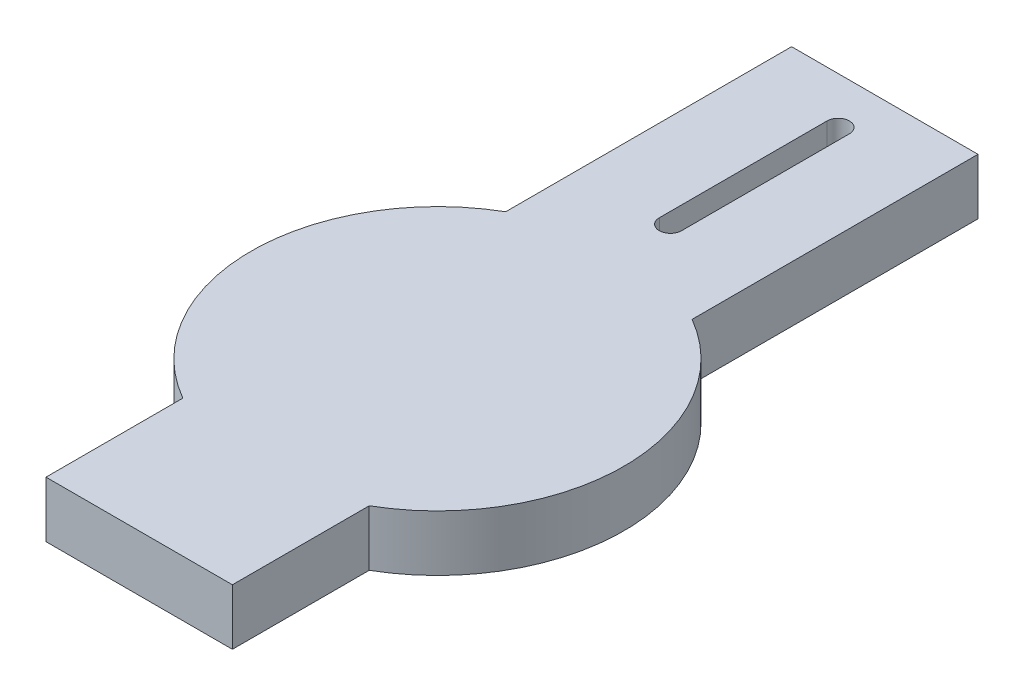
ISO-10303-21;
HEADER;
FILE_DESCRIPTION(('STEP AP214'),'2;1');
FILE_NAME('part.step','',(''),(''),'','','');
FILE_SCHEMA(('AUTOMOTIVE_DESIGN { 1 0 10303 214 1 1 1 1 }'));
ENDSEC;
DATA;
#1=APPLICATION_CONTEXT('core data for automotive mechanical design processes');
#2=APPLICATION_PROTOCOL_DEFINITION('international standard','automotive_design',2000,#1);
#3=PRODUCT_CONTEXT('',#1,'mechanical');
#4=PRODUCT('Part','Part','',(#3));
#5=PRODUCT_RELATED_PRODUCT_CATEGORY('part','',(#4));
#6=PRODUCT_DEFINITION_FORMATION('','',#4);
#7=PRODUCT_DEFINITION_CONTEXT('part definition',#1,'design');
#8=PRODUCT_DEFINITION('design','',#6,#7);
#9=PRODUCT_DEFINITION_SHAPE('','',#8);
#10=(LENGTH_UNIT() NAMED_UNIT(*) SI_UNIT(.MILLI.,.METRE.));
#11=(NAMED_UNIT(*) PLANE_ANGLE_UNIT() SI_UNIT($,.RADIAN.));
#12=(NAMED_UNIT(*) SI_UNIT($,.STERADIAN.) SOLID_ANGLE_UNIT());
#13=UNCERTAINTY_MEASURE_WITH_UNIT(LENGTH_MEASURE(1.E-05),#10,'distance_accuracy_value','');
#14=(GEOMETRIC_REPRESENTATION_CONTEXT(3) GLOBAL_UNCERTAINTY_ASSIGNED_CONTEXT((#13)) GLOBAL_UNIT_ASSIGNED_CONTEXT((#10,
#11,#12)) REPRESENTATION_CONTEXT('',''));
#15=CARTESIAN_POINT('',(0.,0.,0.));
#16=DIRECTION('',(0.,0.,1.));
#17=DIRECTION('',(1.,0.,0.));
#18=AXIS2_PLACEMENT_3D('',#15,#16,#17);
#19=CARTESIAN_POINT('',(0.,3.81,0.));
#20=DIRECTION('',(0.,1.,0.));
#21=DIRECTION('',(0.,0.,1.));
#22=AXIS2_PLACEMENT_3D('',#19,#20,#21);
#23=PLANE('',#22);
#24=DIRECTION('',(-1.,0.,0.));
#25=VECTOR('',#24,1.);
#26=CARTESIAN_POINT('',(-6.35,3.81,-30.48));
#27=LINE('',#26,#25);
#28=CARTESIAN_POINT('',(6.35,3.81,-30.48));
#29=VERTEX_POINT('',#28);
#30=CARTESIAN_POINT('',(-6.35,3.81,-30.48));
#31=VERTEX_POINT('',#30);
#32=EDGE_CURVE('E162',#29,#31,#27,.T.);
#33=ORIENTED_EDGE('',*,*,#32,.T.);
#34=DIRECTION('',(0.,0.,1.));
#35=VECTOR('',#34,1.);
#36=CARTESIAN_POINT('',(-6.35,3.81,-10.9985226280624));
#37=LINE('',#36,#35);
#38=CARTESIAN_POINT('',(-6.34999999999999,3.81,-10.9985226280624));
#39=VERTEX_POINT('',#38);
#40=EDGE_CURVE('E165',#31,#39,#37,.T.);
#41=ORIENTED_EDGE('',*,*,#40,.T.);
#42=CARTESIAN_POINT('',(0.,3.81,0.));
#43=DIRECTION('',(0.,1.,0.));
#44=DIRECTION('',(0.,0.,1.));
#45=AXIS2_PLACEMENT_3D('',#42,#43,#44);
#46=CIRCLE('',#45,12.7);
#47=CARTESIAN_POINT('',(-6.35,3.81,10.9985226280624));
#48=VERTEX_POINT('',#47);
#49=EDGE_CURVE('E168',#39,#48,#46,.T.);
#50=ORIENTED_EDGE('',*,*,#49,.T.);
#51=DIRECTION('',(0.,0.,1.));
#52=VECTOR('',#51,1.);
#53=CARTESIAN_POINT('',(-6.35,3.81,20.32));
#54=LINE('',#53,#52);
#55=CARTESIAN_POINT('',(-6.35,3.81,20.32));
#56=VERTEX_POINT('',#55);
#57=EDGE_CURVE('E170',#48,#56,#54,.T.);
#58=ORIENTED_EDGE('',*,*,#57,.T.);
#59=DIRECTION('',(1.,0.,0.));
#60=VECTOR('',#59,1.);
#61=CARTESIAN_POINT('',(-6.35,3.81,20.32));
#62=LINE('',#61,#60);
#63=CARTESIAN_POINT('',(6.35,3.81,20.32));
#64=VERTEX_POINT('',#63);
#65=EDGE_CURVE('E172',#56,#64,#62,.T.);
#66=ORIENTED_EDGE('',*,*,#65,.T.);
#67=DIRECTION('',(0.,0.,-1.));
#68=VECTOR('',#67,1.);
#69=CARTESIAN_POINT('',(6.35,3.81,20.32));
#70=LINE('',#69,#68);
#71=CARTESIAN_POINT('',(6.35,3.81,10.9985226280624));
#72=VERTEX_POINT('',#71);
#73=EDGE_CURVE('E174',#64,#72,#70,.T.);
#74=ORIENTED_EDGE('',*,*,#73,.T.);
#75=CARTESIAN_POINT('',(0.,3.81,0.));
#76=DIRECTION('',(0.,1.,0.));
#77=DIRECTION('',(0.,0.,1.));
#78=AXIS2_PLACEMENT_3D('',#75,#76,#77);
#79=CIRCLE('',#78,12.7);
#80=CARTESIAN_POINT('',(6.35,3.81,-10.9985226280624));
#81=VERTEX_POINT('',#80);
#82=EDGE_CURVE('E176',#72,#81,#79,.T.);
#83=ORIENTED_EDGE('',*,*,#82,.T.);
#84=DIRECTION('',(0.,0.,-1.));
#85=VECTOR('',#84,1.);
#86=CARTESIAN_POINT('',(6.35,3.81,-10.9985226280624));
#87=LINE('',#86,#85);
#88=EDGE_CURVE('E178',#81,#29,#87,.T.);
#89=ORIENTED_EDGE('',*,*,#88,.T.);
#90=EDGE_LOOP('',(#33,#41,#50,#58,#66,#74,#83,#89));
#91=FACE_BOUND('',#90,.T.);
#92=DIRECTION('',(0.,0.,-1.));
#93=VECTOR('',#92,1.);
#94=CARTESIAN_POINT('',(0.762000000000004,3.81,-15.875));
#95=LINE('',#94,#93);
#96=CARTESIAN_POINT('',(0.762000000000004,3.81,-15.875));
#97=VERTEX_POINT('',#96);
#98=CARTESIAN_POINT('',(0.762000000000004,3.81,-27.305));
#99=VERTEX_POINT('',#98);
#100=EDGE_CURVE('E134',#97,#99,#95,.T.);
#101=ORIENTED_EDGE('',*,*,#100,.F.);
#102=CARTESIAN_POINT('',(0.,3.81,-15.875));
#103=DIRECTION('',(0.,1.,0.));
#104=DIRECTION('',(0.,0.,1.));
#105=AXIS2_PLACEMENT_3D('',#102,#103,#104);
#106=CIRCLE('',#105,0.762);
#107=CARTESIAN_POINT('',(-0.761999999999996,3.81,-15.875));
#108=VERTEX_POINT('',#107);
#109=EDGE_CURVE('E126',#108,#97,#106,.T.);
#110=ORIENTED_EDGE('',*,*,#109,.F.);
#111=DIRECTION('',(0.,0.,1.));
#112=VECTOR('',#111,1.);
#113=CARTESIAN_POINT('',(-0.761999999999996,3.81,-15.875));
#114=LINE('',#113,#112);
#115=CARTESIAN_POINT('',(-0.761999999999996,3.81,-27.305));
#116=VERTEX_POINT('',#115);
#117=EDGE_CURVE('E148',#116,#108,#114,.T.);
#118=ORIENTED_EDGE('',*,*,#117,.F.);
#119=CARTESIAN_POINT('',(0.,3.81,-27.305));
#120=DIRECTION('',(0.,1.,0.));
#121=DIRECTION('',(0.,0.,1.));
#122=AXIS2_PLACEMENT_3D('',#119,#120,#121);
#123=CIRCLE('',#122,0.762);
#124=EDGE_CURVE('E146',#99,#116,#123,.T.);
#125=ORIENTED_EDGE('',*,*,#124,.F.);
#126=EDGE_LOOP('',(#101,#110,#118,#125));
#127=FACE_BOUND('',#126,.T.);
#128=ADVANCED_FACE('F37',(#91,#127),#23,.T.);
#129=CARTESIAN_POINT('',(0.,0.,0.));
#130=DIRECTION('',(0.,1.,0.));
#131=DIRECTION('',(0.,0.,1.));
#132=AXIS2_PLACEMENT_3D('',#129,#130,#131);
#133=PLANE('',#132);
#134=DIRECTION('',(-1.,0.,0.));
#135=VECTOR('',#134,1.);
#136=CARTESIAN_POINT('',(-6.35,0.,-30.48));
#137=LINE('',#136,#135);
#138=CARTESIAN_POINT('',(6.35,0.,-30.48));
#139=VERTEX_POINT('',#138);
#140=CARTESIAN_POINT('',(-6.35,0.,-30.48));
#141=VERTEX_POINT('',#140);
#142=EDGE_CURVE('E142',#139,#141,#137,.T.);
#143=ORIENTED_EDGE('',*,*,#142,.F.);
#144=DIRECTION('',(0.,0.,-1.));
#145=VECTOR('',#144,1.);
#146=CARTESIAN_POINT('',(6.35,0.,-10.9985226280624));
#147=LINE('',#146,#145);
#148=CARTESIAN_POINT('',(6.35,0.,-10.9985226280624));
#149=VERTEX_POINT('',#148);
#150=EDGE_CURVE('E166',#149,#139,#147,.T.);
#151=ORIENTED_EDGE('',*,*,#150,.F.);
#152=CARTESIAN_POINT('',(0.,0.,0.));
#153=DIRECTION('',(0.,1.,0.));
#154=DIRECTION('',(0.,0.,1.));
#155=AXIS2_PLACEMENT_3D('',#152,#153,#154);
#156=CIRCLE('',#155,12.7);
#157=CARTESIAN_POINT('',(6.35,0.,10.9985226280624));
#158=VERTEX_POINT('',#157);
#159=EDGE_CURVE('E193',#158,#149,#156,.T.);
#160=ORIENTED_EDGE('',*,*,#159,.F.);
#161=DIRECTION('',(0.,0.,-1.));
#162=VECTOR('',#161,1.);
#163=CARTESIAN_POINT('',(6.35,0.,20.32));
#164=LINE('',#163,#162);
#165=CARTESIAN_POINT('',(6.35,0.,20.32));
#166=VERTEX_POINT('',#165);
#167=EDGE_CURVE('E191',#166,#158,#164,.T.);
#168=ORIENTED_EDGE('',*,*,#167,.F.);
#169=DIRECTION('',(1.,0.,0.));
#170=VECTOR('',#169,1.);
#171=CARTESIAN_POINT('',(-6.35,0.,20.32));
#172=LINE('',#171,#170);
#173=CARTESIAN_POINT('',(-6.35,0.,20.32));
#174=VERTEX_POINT('',#173);
#175=EDGE_CURVE('E189',#174,#166,#172,.T.);
#176=ORIENTED_EDGE('',*,*,#175,.F.);
#177=DIRECTION('',(0.,0.,1.));
#178=VECTOR('',#177,1.);
#179=CARTESIAN_POINT('',(-6.35,0.,20.32));
#180=LINE('',#179,#178);
#181=CARTESIAN_POINT('',(-6.35,0.,10.9985226280624));
#182=VERTEX_POINT('',#181);
#183=EDGE_CURVE('E187',#182,#174,#180,.T.);
#184=ORIENTED_EDGE('',*,*,#183,.F.);
#185=CARTESIAN_POINT('',(0.,0.,0.));
#186=DIRECTION('',(0.,1.,0.));
#187=DIRECTION('',(0.,0.,1.));
#188=AXIS2_PLACEMENT_3D('',#185,#186,#187);
#189=CIRCLE('',#188,12.7);
#190=CARTESIAN_POINT('',(-6.34999999999999,0.,-10.9985226280624));
#191=VERTEX_POINT('',#190);
#192=EDGE_CURVE('E185',#191,#182,#189,.T.);
#193=ORIENTED_EDGE('',*,*,#192,.F.);
#194=DIRECTION('',(0.,0.,1.));
#195=VECTOR('',#194,1.);
#196=CARTESIAN_POINT('',(-6.35,0.,-10.9985226280624));
#197=LINE('',#196,#195);
#198=EDGE_CURVE('E183',#141,#191,#197,.T.);
#199=ORIENTED_EDGE('',*,*,#198,.F.);
#200=EDGE_LOOP('',(#143,#151,#160,#168,#176,#184,#193,#199));
#201=FACE_BOUND('',#200,.T.);
#202=CARTESIAN_POINT('',(0.,0.,-15.875));
#203=DIRECTION('',(0.,1.,0.));
#204=DIRECTION('',(0.,0.,1.));
#205=AXIS2_PLACEMENT_3D('',#202,#203,#204);
#206=CIRCLE('',#205,0.762);
#207=CARTESIAN_POINT('',(-0.761999999999996,0.,-15.875));
#208=VERTEX_POINT('',#207);
#209=CARTESIAN_POINT('',(0.762000000000004,0.,-15.875));
#210=VERTEX_POINT('',#209);
#211=EDGE_CURVE('E60',#208,#210,#206,.T.);
#212=ORIENTED_EDGE('',*,*,#211,.T.);
#213=DIRECTION('',(0.,0.,-1.));
#214=VECTOR('',#213,1.);
#215=CARTESIAN_POINT('',(0.762000000000004,0.,-15.875));
#216=LINE('',#215,#214);
#217=CARTESIAN_POINT('',(0.762000000000004,0.,-27.305));
#218=VERTEX_POINT('',#217);
#219=EDGE_CURVE('E141',#210,#218,#216,.T.);
#220=ORIENTED_EDGE('',*,*,#219,.T.);
#221=CARTESIAN_POINT('',(0.,0.,-27.305));
#222=DIRECTION('',(0.,1.,0.));
#223=DIRECTION('',(0.,0.,1.));
#224=AXIS2_PLACEMENT_3D('',#221,#222,#223);
#225=CIRCLE('',#224,0.762);
#226=CARTESIAN_POINT('',(-0.761999999999996,0.,-27.305));
#227=VERTEX_POINT('',#226);
#228=EDGE_CURVE('E154',#218,#227,#225,.T.);
#229=ORIENTED_EDGE('',*,*,#228,.T.);
#230=DIRECTION('',(0.,0.,1.));
#231=VECTOR('',#230,1.);
#232=CARTESIAN_POINT('',(-0.761999999999996,0.,-15.875));
#233=LINE('',#232,#231);
#234=EDGE_CURVE('E135',#227,#208,#233,.T.);
#235=ORIENTED_EDGE('',*,*,#234,.T.);
#236=EDGE_LOOP('',(#212,#220,#229,#235));
#237=FACE_BOUND('',#236,.T.);
#238=ADVANCED_FACE('F223',(#201,#237),#133,.F.);
#239=CARTESIAN_POINT('',(-6.35,3.81,-30.48));
#240=DIRECTION('',(0.,0.,1.));
#241=DIRECTION('',(1.,0.,0.));
#242=AXIS2_PLACEMENT_3D('',#239,#240,#241);
#243=PLANE('',#242);
#244=ORIENTED_EDGE('',*,*,#142,.T.);
#245=DIRECTION('',(0.,-1.,0.));
#246=VECTOR('',#245,1.);
#247=CARTESIAN_POINT('',(-6.35,3.81,-30.48));
#248=LINE('',#247,#246);
#249=EDGE_CURVE('E11',#31,#141,#248,.T.);
#250=ORIENTED_EDGE('',*,*,#249,.F.);
#251=ORIENTED_EDGE('',*,*,#32,.F.);
#252=DIRECTION('',(0.,-1.,0.));
#253=VECTOR('',#252,1.);
#254=CARTESIAN_POINT('',(6.35,3.81,-30.48));
#255=LINE('',#254,#253);
#256=EDGE_CURVE('E180',#29,#139,#255,.T.);
#257=ORIENTED_EDGE('',*,*,#256,.T.);
#258=EDGE_LOOP('',(#244,#250,#251,#257));
#259=FACE_BOUND('',#258,.T.);
#260=ADVANCED_FACE('F39',(#259),#243,.F.);
#261=CARTESIAN_POINT('',(-6.35,3.81,-10.9985226280624));
#262=DIRECTION('',(1.,0.,0.));
#263=DIRECTION('',(0.,0.,-1.));
#264=AXIS2_PLACEMENT_3D('',#261,#262,#263);
#265=PLANE('',#264);
#266=ORIENTED_EDGE('',*,*,#198,.T.);
#267=DIRECTION('',(0.,-1.,0.));
#268=VECTOR('',#267,1.);
#269=CARTESIAN_POINT('',(-6.34999999999999,3.81,-10.9985226280624));
#270=LINE('',#269,#268);
#271=EDGE_CURVE('E45',#39,#191,#270,.T.);
#272=ORIENTED_EDGE('',*,*,#271,.F.);
#273=ORIENTED_EDGE('',*,*,#40,.F.);
#274=ORIENTED_EDGE('',*,*,#249,.T.);
#275=EDGE_LOOP('',(#266,#272,#273,#274));
#276=FACE_BOUND('',#275,.T.);
#277=ADVANCED_FACE('F240',(#276),#265,.F.);
#278=CARTESIAN_POINT('',(0.,3.81,0.));
#279=DIRECTION('',(0.,-1.,0.));
#280=DIRECTION('',(0.,0.,-1.));
#281=AXIS2_PLACEMENT_3D('',#278,#279,#280);
#282=CYLINDRICAL_SURFACE('',#281,12.7);
#283=ORIENTED_EDGE('',*,*,#192,.T.);
#284=DIRECTION('',(0.,-1.,0.));
#285=VECTOR('',#284,1.);
#286=CARTESIAN_POINT('',(-6.35,3.81,10.9985226280624));
#287=LINE('',#286,#285);
#288=EDGE_CURVE('E210',#48,#182,#287,.T.);
#289=ORIENTED_EDGE('',*,*,#288,.F.);
#290=ORIENTED_EDGE('',*,*,#49,.F.);
#291=ORIENTED_EDGE('',*,*,#271,.T.);
#292=EDGE_LOOP('',(#283,#289,#290,#291));
#293=FACE_BOUND('',#292,.T.);
#294=ADVANCED_FACE('F217',(#293),#282,.T.);
#295=CARTESIAN_POINT('',(-6.35,3.81,20.32));
#296=DIRECTION('',(1.,0.,0.));
#297=DIRECTION('',(0.,0.,-1.));
#298=AXIS2_PLACEMENT_3D('',#295,#296,#297);
#299=PLANE('',#298);
#300=ORIENTED_EDGE('',*,*,#183,.T.);
#301=DIRECTION('',(0.,-1.,0.));
#302=VECTOR('',#301,1.);
#303=CARTESIAN_POINT('',(-6.35,3.81,20.32));
#304=LINE('',#303,#302);
#305=EDGE_CURVE('E207',#56,#174,#304,.T.);
#306=ORIENTED_EDGE('',*,*,#305,.F.);
#307=ORIENTED_EDGE('',*,*,#57,.F.);
#308=ORIENTED_EDGE('',*,*,#288,.T.);
#309=EDGE_LOOP('',(#300,#306,#307,#308));
#310=FACE_BOUND('',#309,.T.);
#311=ADVANCED_FACE('F229',(#310),#299,.F.);
#312=CARTESIAN_POINT('',(-6.35,3.81,20.32));
#313=DIRECTION('',(0.,0.,-1.));
#314=DIRECTION('',(-1.,0.,0.));
#315=AXIS2_PLACEMENT_3D('',#312,#313,#314);
#316=PLANE('',#315);
#317=ORIENTED_EDGE('',*,*,#175,.T.);
#318=DIRECTION('',(0.,-1.,0.));
#319=VECTOR('',#318,1.);
#320=CARTESIAN_POINT('',(6.35,3.81,20.32));
#321=LINE('',#320,#319);
#322=EDGE_CURVE('E204',#64,#166,#321,.T.);
#323=ORIENTED_EDGE('',*,*,#322,.F.);
#324=ORIENTED_EDGE('',*,*,#65,.F.);
#325=ORIENTED_EDGE('',*,*,#305,.T.);
#326=EDGE_LOOP('',(#317,#323,#324,#325));
#327=FACE_BOUND('',#326,.T.);
#328=ADVANCED_FACE('F233',(#327),#316,.F.);
#329=CARTESIAN_POINT('',(6.35,3.81,20.32));
#330=DIRECTION('',(-1.,0.,0.));
#331=DIRECTION('',(0.,0.,1.));
#332=AXIS2_PLACEMENT_3D('',#329,#330,#331);
#333=PLANE('',#332);
#334=ORIENTED_EDGE('',*,*,#167,.T.);
#335=DIRECTION('',(0.,-1.,0.));
#336=VECTOR('',#335,1.);
#337=CARTESIAN_POINT('',(6.35,3.81,10.9985226280624));
#338=LINE('',#337,#336);
#339=EDGE_CURVE('E201',#72,#158,#338,.T.);
#340=ORIENTED_EDGE('',*,*,#339,.F.);
#341=ORIENTED_EDGE('',*,*,#73,.F.);
#342=ORIENTED_EDGE('',*,*,#322,.T.);
#343=EDGE_LOOP('',(#334,#340,#341,#342));
#344=FACE_BOUND('',#343,.T.);
#345=ADVANCED_FACE('F253',(#344),#333,.F.);
#346=CARTESIAN_POINT('',(0.,3.81,0.));
#347=DIRECTION('',(0.,-1.,0.));
#348=DIRECTION('',(0.,0.,-1.));
#349=AXIS2_PLACEMENT_3D('',#346,#347,#348);
#350=CYLINDRICAL_SURFACE('',#349,12.7);
#351=ORIENTED_EDGE('',*,*,#159,.T.);
#352=DIRECTION('',(0.,-1.,0.));
#353=VECTOR('',#352,1.);
#354=CARTESIAN_POINT('',(6.35,3.81,-10.9985226280624));
#355=LINE('',#354,#353);
#356=EDGE_CURVE('E198',#81,#149,#355,.T.);
#357=ORIENTED_EDGE('',*,*,#356,.F.);
#358=ORIENTED_EDGE('',*,*,#82,.F.);
#359=ORIENTED_EDGE('',*,*,#339,.T.);
#360=EDGE_LOOP('',(#351,#357,#358,#359));
#361=FACE_BOUND('',#360,.T.);
#362=ADVANCED_FACE('F251',(#361),#350,.T.);
#363=CARTESIAN_POINT('',(6.35,3.81,-10.9985226280624));
#364=DIRECTION('',(-1.,0.,0.));
#365=DIRECTION('',(0.,0.,1.));
#366=AXIS2_PLACEMENT_3D('',#363,#364,#365);
#367=PLANE('',#366);
#368=ORIENTED_EDGE('',*,*,#150,.T.);
#369=ORIENTED_EDGE('',*,*,#256,.F.);
#370=ORIENTED_EDGE('',*,*,#88,.F.);
#371=ORIENTED_EDGE('',*,*,#356,.T.);
#372=EDGE_LOOP('',(#368,#369,#370,#371));
#373=FACE_BOUND('',#372,.T.);
#374=ADVANCED_FACE('F246',(#373),#367,.F.);
#375=CARTESIAN_POINT('',(0.,3.81,-15.875));
#376=DIRECTION('',(0.,-1.,0.));
#377=DIRECTION('',(0.,0.,-1.));
#378=AXIS2_PLACEMENT_3D('',#375,#376,#377);
#379=CYLINDRICAL_SURFACE('',#378,0.762);
#380=ORIENTED_EDGE('',*,*,#211,.F.);
#381=DIRECTION('',(0.,-1.,0.));
#382=VECTOR('',#381,1.);
#383=CARTESIAN_POINT('',(-0.761999999999996,3.81,-15.875));
#384=LINE('',#383,#382);
#385=EDGE_CURVE('E130',#108,#208,#384,.T.);
#386=ORIENTED_EDGE('',*,*,#385,.F.);
#387=ORIENTED_EDGE('',*,*,#109,.T.);
#388=DIRECTION('',(0.,-1.,0.));
#389=VECTOR('',#388,1.);
#390=CARTESIAN_POINT('',(0.762000000000004,3.81,-15.875));
#391=LINE('',#390,#389);
#392=EDGE_CURVE('E129',#97,#210,#391,.T.);
#393=ORIENTED_EDGE('',*,*,#392,.T.);
#394=EDGE_LOOP('',(#380,#386,#387,#393));
#395=FACE_BOUND('',#394,.T.);
#396=ADVANCED_FACE('F128',(#395),#379,.F.);
#397=CARTESIAN_POINT('',(0.762000000000004,3.81,-15.875));
#398=DIRECTION('',(-1.,0.,0.));
#399=DIRECTION('',(0.,0.,1.));
#400=AXIS2_PLACEMENT_3D('',#397,#398,#399);
#401=PLANE('',#400);
#402=ORIENTED_EDGE('',*,*,#219,.F.);
#403=ORIENTED_EDGE('',*,*,#392,.F.);
#404=ORIENTED_EDGE('',*,*,#100,.T.);
#405=DIRECTION('',(0.,-1.,0.));
#406=VECTOR('',#405,1.);
#407=CARTESIAN_POINT('',(0.762000000000004,3.81,-27.305));
#408=LINE('',#407,#406);
#409=EDGE_CURVE('E143',#99,#218,#408,.T.);
#410=ORIENTED_EDGE('',*,*,#409,.T.);
#411=EDGE_LOOP('',(#402,#403,#404,#410));
#412=FACE_BOUND('',#411,.T.);
#413=ADVANCED_FACE('F138',(#412),#401,.T.);
#414=CARTESIAN_POINT('',(0.,3.81,-27.305));
#415=DIRECTION('',(0.,-1.,0.));
#416=DIRECTION('',(0.,0.,-1.));
#417=AXIS2_PLACEMENT_3D('',#414,#415,#416);
#418=CYLINDRICAL_SURFACE('',#417,0.762);
#419=ORIENTED_EDGE('',*,*,#228,.F.);
#420=ORIENTED_EDGE('',*,*,#409,.F.);
#421=ORIENTED_EDGE('',*,*,#124,.T.);
#422=DIRECTION('',(0.,-1.,0.));
#423=VECTOR('',#422,1.);
#424=CARTESIAN_POINT('',(-0.761999999999996,3.81,-27.305));
#425=LINE('',#424,#423);
#426=EDGE_CURVE('E52',#116,#227,#425,.T.);
#427=ORIENTED_EDGE('',*,*,#426,.T.);
#428=EDGE_LOOP('',(#419,#420,#421,#427));
#429=FACE_BOUND('',#428,.T.);
#430=ADVANCED_FACE('F278',(#429),#418,.F.);
#431=CARTESIAN_POINT('',(-0.761999999999996,3.81,-15.875));
#432=DIRECTION('',(1.,0.,0.));
#433=DIRECTION('',(0.,0.,-1.));
#434=AXIS2_PLACEMENT_3D('',#431,#432,#433);
#435=PLANE('',#434);
#436=ORIENTED_EDGE('',*,*,#234,.F.);
#437=ORIENTED_EDGE('',*,*,#426,.F.);
#438=ORIENTED_EDGE('',*,*,#117,.T.);
#439=ORIENTED_EDGE('',*,*,#385,.T.);
#440=EDGE_LOOP('',(#436,#437,#438,#439));
#441=FACE_BOUND('',#440,.T.);
#442=ADVANCED_FACE('F282',(#441),#435,.T.);
#443=CLOSED_SHELL('',(#128,#238,#260,#277,#294,#311,#328,#345,#362,#374,#396,#413,#430,#442));
#444=MANIFOLD_SOLID_BREP('B2',#443);
#445=ADVANCED_BREP_SHAPE_REPRESENTATION('',(#18,#444),#14);
#446=SHAPE_DEFINITION_REPRESENTATION(#9,#445);
ENDSEC;
END-ISO-10303-21;
